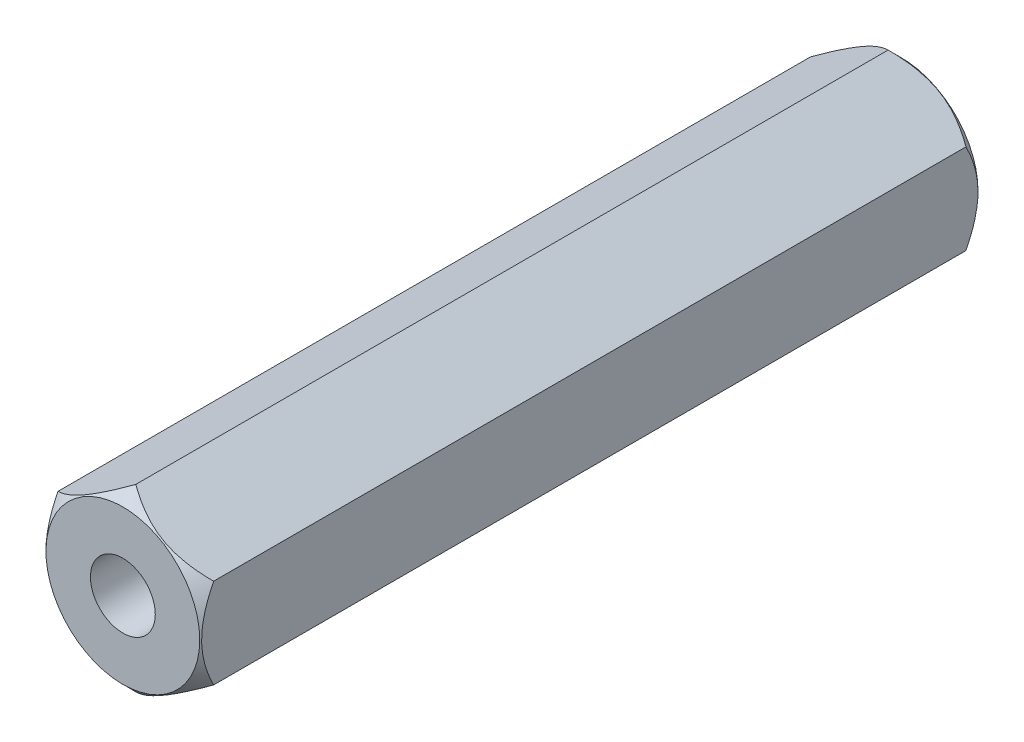
ISO-10303-21;
HEADER;
FILE_DESCRIPTION(('STEP AP214'),'2;1');
FILE_NAME('part.step','',(''),(''),'','','');
FILE_SCHEMA(('AUTOMOTIVE_DESIGN { 1 0 10303 214 1 1 1 1 }'));
ENDSEC;
DATA;
#1=APPLICATION_CONTEXT('core data for automotive mechanical design processes');
#2=APPLICATION_PROTOCOL_DEFINITION('international standard','automotive_design',2000,#1);
#3=PRODUCT_CONTEXT('',#1,'mechanical');
#4=PRODUCT('Part','Part','',(#3));
#5=PRODUCT_RELATED_PRODUCT_CATEGORY('part','',(#4));
#6=PRODUCT_DEFINITION_FORMATION('','',#4);
#7=PRODUCT_DEFINITION_CONTEXT('part definition',#1,'design');
#8=PRODUCT_DEFINITION('design','',#6,#7);
#9=PRODUCT_DEFINITION_SHAPE('','',#8);
#10=(LENGTH_UNIT() NAMED_UNIT(*) SI_UNIT(.MILLI.,.METRE.));
#11=(NAMED_UNIT(*) PLANE_ANGLE_UNIT() SI_UNIT($,.RADIAN.));
#12=(NAMED_UNIT(*) SI_UNIT($,.STERADIAN.) SOLID_ANGLE_UNIT());
#13=UNCERTAINTY_MEASURE_WITH_UNIT(LENGTH_MEASURE(1.E-05),#10,'distance_accuracy_value','');
#14=(GEOMETRIC_REPRESENTATION_CONTEXT(3) GLOBAL_UNCERTAINTY_ASSIGNED_CONTEXT((#13)) GLOBAL_UNIT_ASSIGNED_CONTEXT((#10,
#11,#12)) REPRESENTATION_CONTEXT('',''));
#15=CARTESIAN_POINT('',(0.,0.,0.));
#16=DIRECTION('',(0.,0.,1.));
#17=DIRECTION('',(1.,0.,0.));
#18=AXIS2_PLACEMENT_3D('',#15,#16,#17);
#19=CARTESIAN_POINT('',(2.99999999999998,1.73205080756891,15.));
#20=DIRECTION('',(-0.499999999999995,-0.866025403784441,0.));
#21=DIRECTION('',(0.866025403784442,-0.499999999999995,0.));
#22=AXIS2_PLACEMENT_3D('',#19,#20,#21);
#23=PLANE('',#22);
#24=CARTESIAN_POINT('',(3.00019999999998,1.73193533751508,14.4998845241729));
#25=CARTESIAN_POINT('',(2.89707648504423,1.79147372663456,14.5593716816782));
#26=CARTESIAN_POINT('',(2.79222861066933,1.85200767512887,14.6153650205345));
#27=CARTESIAN_POINT('',(2.57843232821888,1.97544301635337,14.7178874036211));
#28=CARTESIAN_POINT('',(2.46946358862022,2.03835614749391,14.7643594062587));
#29=CARTESIAN_POINT('',(2.24973336040295,2.16521745390425,14.8439668114837));
#30=CARTESIAN_POINT('',(2.13902782823776,2.2291333227006,14.8773022993573));
#31=CARTESIAN_POINT('',(1.91517958943465,2.3583721636312,14.9286624560207));
#32=CARTESIAN_POINT('',(1.80204372079298,2.42369118784647,14.9467254624644));
#33=CARTESIAN_POINT('',(1.60705904380727,2.53626564359202,14.9630230915495));
#34=CARTESIAN_POINT('',(1.52546204599784,2.58337569224236,14.9654356328262));
#35=CARTESIAN_POINT('',(1.36240077116988,2.67751916315868,14.9613705653429));
#36=CARTESIAN_POINT('',(1.28093655070098,2.72455255277573,14.9548898399717));
#37=CARTESIAN_POINT('',(1.11877988766159,2.81817374583241,14.9334082774848));
#38=CARTESIAN_POINT('',(1.03808841121566,2.86476099147977,14.9183979100327));
#39=CARTESIAN_POINT('',(0.87809130210862,2.95713536549228,14.880676353934));
#40=CARTESIAN_POINT('',(0.798785563690657,3.00292255491618,14.8579657556771));
#41=CARTESIAN_POINT('',(0.657993859197203,3.08420868340514,14.811239315146));
#42=CARTESIAN_POINT('',(0.596196277853935,3.11988753362894,14.7884516723192));
#43=CARTESIAN_POINT('',(0.473710582479749,3.1906046828251,14.7392037139425));
#44=CARTESIAN_POINT('',(0.41302250236437,3.22564296221632,14.7127432863338));
#45=CARTESIAN_POINT('',(0.292947002609118,3.29496858432309,14.6567430056086));
#46=CARTESIAN_POINT('',(0.233556167704067,3.32925789884292,14.6272128355216));
#47=CARTESIAN_POINT('',(0.115874438532723,3.39720147685869,14.5654609084245));
#48=CARTESIAN_POINT('',(0.0575828957522616,3.43085611477447,14.5332408033406));
#49=CARTESIAN_POINT('',(-0.000200000000000063,3.46421708519159,14.4998845241729));
#50=B_SPLINE_CURVE_WITH_KNOTS('',3,(#24,#25,#26,#27,#28,#29,#30,#31,#32,#33,#34,#35,#36,#37,#38,
#39,#40,#41,#42,#43,#44,#45,#46,#47,#48,#49),.UNSPECIFIED.,.F.,.F.,(4,2,2,2,2,2,2,2,2,2,2,2,4),
(0.,0.399603557139306,0.801535286397845,1.19708369162343,1.59163620080173,1.87398941755845,
2.15644160919094,2.43921001247427,2.7219567403214,2.94657516661927,3.17120044767273,
3.39513752837807,3.61893808380735),.UNSPECIFIED.);
#51=CARTESIAN_POINT('',(2.99999999999998,1.73205080756891,14.5));
#52=VERTEX_POINT('',#51);
#53=CARTESIAN_POINT('',(0.,3.46410161513776,14.5));
#54=VERTEX_POINT('',#53);
#55=EDGE_CURVE('E85',#52,#54,#50,.T.);
#56=ORIENTED_EDGE('',*,*,#55,.F.);
#57=DIRECTION('',(0.,0.,-1.));
#58=VECTOR('',#57,1.);
#59=CARTESIAN_POINT('',(2.99999999999998,1.73205080756891,15.));
#60=LINE('',#59,#58);
#61=CARTESIAN_POINT('',(2.99999999999998,1.73205080756891,-14.5));
#62=VERTEX_POINT('',#61);
#63=EDGE_CURVE('E55',#52,#62,#60,.T.);
#64=ORIENTED_EDGE('',*,*,#63,.T.);
#65=CARTESIAN_POINT('',(-0.0002,3.46421708519159,-14.4998845241729));
#66=CARTESIAN_POINT('',(0.102923514955747,3.40467869607211,-14.5593716816782));
#67=CARTESIAN_POINT('',(0.207771389330649,3.34414474757781,-14.6153650205345));
#68=CARTESIAN_POINT('',(0.421567671781093,3.2207094063533,-14.7178874036211));
#69=CARTESIAN_POINT('',(0.530536411379756,3.15779627521276,-14.7643594062587));
#70=CARTESIAN_POINT('',(0.750266639597023,3.03093496880243,-14.8439668114837));
#71=CARTESIAN_POINT('',(0.860972171762205,2.96701910000608,-14.8773022993573));
#72=CARTESIAN_POINT('',(1.08482041056532,2.83778025907548,-14.9286624560207));
#73=CARTESIAN_POINT('',(1.19795627920698,2.77246123486021,-14.9467254624644));
#74=CARTESIAN_POINT('',(1.39294095619269,2.65988677911466,-14.9630230915495));
#75=CARTESIAN_POINT('',(1.47453795400212,2.61277673046432,-14.9654356328262));
#76=CARTESIAN_POINT('',(1.63759922883008,2.518633259548,-14.9613705653429));
#77=CARTESIAN_POINT('',(1.71906344929898,2.47159986993096,-14.9548898399717));
#78=CARTESIAN_POINT('',(1.88122011233836,2.37797867687428,-14.9334082774848));
#79=CARTESIAN_POINT('',(1.96191158878429,2.33139143122691,-14.9183979100327));
#80=CARTESIAN_POINT('',(2.12190869789133,2.23901705721441,-14.880676353934));
#81=CARTESIAN_POINT('',(2.20121443630929,2.19322986779052,-14.8579657556772));
#82=CARTESIAN_POINT('',(2.34200614080274,2.11194373930155,-14.8112393151461));
#83=CARTESIAN_POINT('',(2.40380372214602,2.07626488907775,-14.7884516723192));
#84=CARTESIAN_POINT('',(2.52628941752021,2.00554773988158,-14.7392037139426));
#85=CARTESIAN_POINT('',(2.58697749763559,1.97050946049036,-14.7127432863338));
#86=CARTESIAN_POINT('',(2.70705299739085,1.90118383838359,-14.6567430056086));
#87=CARTESIAN_POINT('',(2.7664438322959,1.86689452386376,-14.6272128355216));
#88=CARTESIAN_POINT('',(2.88412556146725,1.79895094584798,-14.5654609084245));
#89=CARTESIAN_POINT('',(2.94241710424772,1.7652963079322,-14.5332408033406));
#90=CARTESIAN_POINT('',(3.00019999999998,1.73193533751508,-14.4998845241729));
#91=B_SPLINE_CURVE_WITH_KNOTS('',3,(#65,#66,#67,#68,#69,#70,#71,#72,#73,#74,#75,#76,#77,#78,#79,
#80,#81,#82,#83,#84,#85,#86,#87,#88,#89,#90),.UNSPECIFIED.,.F.,.F.,(4,2,2,2,2,2,2,2,2,2,2,2,4),
(0.,0.399603557139302,0.801535286397835,1.19708369162341,1.59163620080171,1.87398941755842,
2.15644160919091,2.43921001247423,2.72195674032136,2.94657516661924,3.17120044767272,
3.39513752837807,3.61893808380735),.UNSPECIFIED.);
#92=CARTESIAN_POINT('',(0.,3.46410161513776,-14.5));
#93=VERTEX_POINT('',#92);
#94=EDGE_CURVE('E100',#93,#62,#91,.T.);
#95=ORIENTED_EDGE('',*,*,#94,.F.);
#96=DIRECTION('',(0.,0.,-1.));
#97=VECTOR('',#96,1.);
#98=CARTESIAN_POINT('',(0.,3.46410161513776,15.));
#99=LINE('',#98,#97);
#100=EDGE_CURVE('E11',#54,#93,#99,.T.);
#101=ORIENTED_EDGE('',*,*,#100,.F.);
#102=EDGE_LOOP('',(#56,#64,#95,#101));
#103=FACE_BOUND('',#102,.T.);
#104=ADVANCED_FACE('F32',(#103),#23,.F.);
#105=CARTESIAN_POINT('',(0.,3.46410161513776,15.));
#106=DIRECTION('',(0.500000000000001,-0.866025403784438,0.));
#107=DIRECTION('',(0.866025403784438,0.500000000000001,0.));
#108=AXIS2_PLACEMENT_3D('',#105,#106,#107);
#109=PLANE('',#108);
#110=CARTESIAN_POINT('',(0.000200000000000247,3.46421708519159,14.4998845241729));
#111=CARTESIAN_POINT('',(-0.102923514955749,3.40467869607211,14.5593716816782));
#112=CARTESIAN_POINT('',(-0.207771389330652,3.3441447475778,14.6153650205345));
#113=CARTESIAN_POINT('',(-0.421567671781101,3.22070940635329,14.7178874036211));
#114=CARTESIAN_POINT('',(-0.530536411379767,3.15779627521275,14.7643594062587));
#115=CARTESIAN_POINT('',(-0.750266639597039,3.03093496880241,14.8439668114837));
#116=CARTESIAN_POINT('',(-0.860972171762223,2.96701910000606,14.8773022993573));
#117=CARTESIAN_POINT('',(-1.08482041056534,2.83778025907546,14.9286624560207));
#118=CARTESIAN_POINT('',(-1.19795627920701,2.77246123486019,14.9467254624644));
#119=CARTESIAN_POINT('',(-1.39294095619272,2.65988677911463,14.9630230915495));
#120=CARTESIAN_POINT('',(-1.47453795400215,2.61277673046429,14.9654356328262));
#121=CARTESIAN_POINT('',(-1.63759922883011,2.51863325954797,14.9613705653429));
#122=CARTESIAN_POINT('',(-1.71906344929901,2.47159986993092,14.9548898399717));
#123=CARTESIAN_POINT('',(-1.8812201123384,2.37797867687424,14.9334082774848));
#124=CARTESIAN_POINT('',(-1.96191158878433,2.33139143122688,14.9183979100327));
#125=CARTESIAN_POINT('',(-2.12190869789137,2.23901705721437,14.880676353934));
#126=CARTESIAN_POINT('',(-2.20121443630933,2.19322986779047,14.8579657556772));
#127=CARTESIAN_POINT('',(-2.34200614080278,2.11194373930151,14.811239315146));
#128=CARTESIAN_POINT('',(-2.40380372214605,2.0762648890777,14.7884516723192));
#129=CARTESIAN_POINT('',(-2.52628941752024,2.00554773988154,14.7392037139425));
#130=CARTESIAN_POINT('',(-2.58697749763562,1.97050946049032,14.7127432863338));
#131=CARTESIAN_POINT('',(-2.70705299739088,1.90118383838354,14.6567430056086));
#132=CARTESIAN_POINT('',(-2.76644383229593,1.86689452386372,14.6272128355216));
#133=CARTESIAN_POINT('',(-2.88412556146728,1.79895094584794,14.5654609084245));
#134=CARTESIAN_POINT('',(-2.94241710424774,1.76529630793216,14.5332408033406));
#135=CARTESIAN_POINT('',(-3.00020000000001,1.73193533751503,14.4998845241729));
#136=B_SPLINE_CURVE_WITH_KNOTS('',3,(#110,#111,#112,#113,#114,#115,#116,#117,#118,#119,#120,
#121,#122,#123,#124,#125,#126,#127,#128,#129,#130,#131,#132,#133,#134,#135),.UNSPECIFIED.,.F.,
.F.,(4,2,2,2,2,2,2,2,2,2,2,2,4),(0.,0.399603557139311,0.801535286397855,1.19708369162344,
1.59163620080175,1.87398941755847,2.15644160919096,2.43921001247428,2.72195674032142,
2.9465751666193,3.17120044767277,3.39513752837811,3.6189380838074),.UNSPECIFIED.);
#137=CARTESIAN_POINT('',(-3.00000000000001,1.73205080756887,14.5));
#138=VERTEX_POINT('',#137);
#139=EDGE_CURVE('E93',#54,#138,#136,.T.);
#140=ORIENTED_EDGE('',*,*,#139,.F.);
#141=ORIENTED_EDGE('',*,*,#100,.T.);
#142=CARTESIAN_POINT('',(-3.00020000000001,1.73193533751503,-14.4998845241729));
#143=CARTESIAN_POINT('',(-2.89707648504426,1.79147372663452,-14.5593716816782));
#144=CARTESIAN_POINT('',(-2.79222861066936,1.85200767512883,-14.6153650205345));
#145=CARTESIAN_POINT('',(-2.57843232821891,1.97544301635333,-14.7178874036211));
#146=CARTESIAN_POINT('',(-2.46946358862025,2.03835614749387,-14.7643594062587));
#147=CARTESIAN_POINT('',(-2.24973336040298,2.16521745390421,-14.8439668114837));
#148=CARTESIAN_POINT('',(-2.13902782823779,2.22913332270056,-14.8773022993573));
#149=CARTESIAN_POINT('',(-1.91517958943468,2.35837216363116,-14.9286624560207));
#150=CARTESIAN_POINT('',(-1.80204372079301,2.42369118784643,-14.9467254624644));
#151=CARTESIAN_POINT('',(-1.6070590438073,2.53626564359199,-14.9630230915495));
#152=CARTESIAN_POINT('',(-1.52546204599787,2.58337569224233,-14.9654356328262));
#153=CARTESIAN_POINT('',(-1.36240077116992,2.67751916315865,-14.9613705653429));
#154=CARTESIAN_POINT('',(-1.28093655070102,2.72455255277569,-14.9548898399717));
#155=CARTESIAN_POINT('',(-1.11877988766164,2.81817374583237,-14.9334082774848));
#156=CARTESIAN_POINT('',(-1.03808841121571,2.86476099147974,-14.9183979100327));
#157=CARTESIAN_POINT('',(-0.878091302108673,2.95713536549224,-14.880676353934));
#158=CARTESIAN_POINT('',(-0.798785563690712,3.00292255491614,-14.8579657556772));
#159=CARTESIAN_POINT('',(-0.657993859197255,3.0842086834051,-14.8112393151461));
#160=CARTESIAN_POINT('',(-0.596196277853981,3.11988753362891,-14.7884516723192));
#161=CARTESIAN_POINT('',(-0.473710582479786,3.19060468282508,-14.7392037139426));
#162=CARTESIAN_POINT('',(-0.413022502364402,3.2256429622163,-14.7127432863338));
#163=CARTESIAN_POINT('',(-0.292947002609141,3.29496858432307,-14.6567430056086));
#164=CARTESIAN_POINT('',(-0.233556167704085,3.32925789884291,-14.6272128355216));
#165=CARTESIAN_POINT('',(-0.115874438532732,3.39720147685869,-14.5654609084245));
#166=CARTESIAN_POINT('',(-0.0575828957522661,3.43085611477447,-14.5332408033406));
#167=CARTESIAN_POINT('',(0.000199999999999981,3.46421708519159,-14.4998845241729));
#168=B_SPLINE_CURVE_WITH_KNOTS('',3,(#142,#143,#144,#145,#146,#147,#148,#149,#150,#151,#152,
#153,#154,#155,#156,#157,#158,#159,#160,#161,#162,#163,#164,#165,#166,#167),.UNSPECIFIED.,.F.,
.F.,(4,2,2,2,2,2,2,2,2,2,2,2,4),(0.,0.399603557139307,0.801535286397846,1.19708369162343,
1.59163620080173,1.87398941755844,2.15644160919093,2.43921001247425,2.72195674032138,
2.94657516661927,3.17120044767275,3.39513752837811,3.6189380838074),.UNSPECIFIED.);
#169=CARTESIAN_POINT('',(-3.00000000000001,1.73205080756887,-14.5));
#170=VERTEX_POINT('',#169);
#171=EDGE_CURVE('E104',#170,#93,#168,.T.);
#172=ORIENTED_EDGE('',*,*,#171,.F.);
#173=DIRECTION('',(0.,0.,-1.));
#174=VECTOR('',#173,1.);
#175=CARTESIAN_POINT('',(-3.00000000000001,1.73205080756887,15.));
#176=LINE('',#175,#174);
#177=EDGE_CURVE('E40',#138,#170,#176,.T.);
#178=ORIENTED_EDGE('',*,*,#177,.F.);
#179=EDGE_LOOP('',(#140,#141,#172,#178));
#180=FACE_BOUND('',#179,.T.);
#181=ADVANCED_FACE('F134',(#180),#109,.F.);
#182=CARTESIAN_POINT('',(-3.00000000000001,1.73205080756887,15.));
#183=DIRECTION('',(1.,0.,0.));
#184=DIRECTION('',(0.,1.,0.));
#185=AXIS2_PLACEMENT_3D('',#182,#183,#184);
#186=PLANE('',#185);
#187=CARTESIAN_POINT('',(-2.99999999999999,-3.60017220967184,13.2778195131626));
#188=CARTESIAN_POINT('',(-2.99999999999999,-3.51313765104596,13.3446675914289));
#189=CARTESIAN_POINT('',(-2.99999999999999,-3.42563249287245,13.4109126193683));
#190=CARTESIAN_POINT('',(-2.99999999999999,-3.24948921836676,13.5419215469166));
#191=CARTESIAN_POINT('',(-2.99999999999999,-3.16085083752023,13.6066850905043));
#192=CARTESIAN_POINT('',(-2.99999999999999,-2.98160145725482,13.7349169449311));
#193=CARTESIAN_POINT('',(-2.99999999999999,-2.89098051262274,13.7983713994157));
#194=CARTESIAN_POINT('',(-2.99999999999999,-2.70822761313702,13.9230583092626));
#195=CARTESIAN_POINT('',(-2.99999999999999,-2.61609576318253,13.9842909179429));
#196=CARTESIAN_POINT('',(-2.99999999999999,-2.42422306954656,14.1077912376853));
#197=CARTESIAN_POINT('',(-2.99999999999999,-2.32436788808333,14.1698822034749));
#198=CARTESIAN_POINT('',(-2.99999999999999,-2.12231355534729,14.2901903464936));
#199=CARTESIAN_POINT('',(-2.99999999999999,-2.02011401548863,14.3484068751903));
#200=CARTESIAN_POINT('',(-2.99999999999999,-1.81334633897,14.4597248507824));
#201=CARTESIAN_POINT('',(-2.99999999999999,-1.70878635206411,14.512841317048));
#202=CARTESIAN_POINT('',(-2.99999999999999,-1.49671956345561,14.6127691597761));
#203=CARTESIAN_POINT('',(-2.99999999999999,-1.3892141758587,14.6595835002325));
#204=CARTESIAN_POINT('',(-3.,-1.18162451020427,14.7410539482376));
#205=CARTESIAN_POINT('',(-3.,-1.08183332025572,14.7764492520355));
#206=CARTESIAN_POINT('',(-3.,-0.879720922244446,14.839250905853));
#207=CARTESIAN_POINT('',(-3.,-0.777399552418952,14.8666567436397));
#208=CARTESIAN_POINT('',(-3.,-0.572612584452616,14.9115441590153));
#209=CARTESIAN_POINT('',(-3.,-0.470186961346727,14.9292050562223));
#210=CARTESIAN_POINT('',(-3.,-0.264078945488506,14.9542362750333));
#211=CARTESIAN_POINT('',(-3.,-0.160396813561161,14.9616086966165));
#212=CARTESIAN_POINT('',(-3.,0.0427096176213919,14.9654420851551));
#213=CARTESIAN_POINT('',(-3.,0.142125414358262,14.9623583505179));
#214=CARTESIAN_POINT('',(-3.,0.340174705596965,14.9464916416953));
#215=CARTESIAN_POINT('',(-3.,0.438808127729188,14.9337077805808));
#216=CARTESIAN_POINT('',(-3.,0.63624994970367,14.8989440803276));
#217=CARTESIAN_POINT('',(-3.,0.735029372915854,14.876802418897));
#218=CARTESIAN_POINT('',(-3.,0.930415217780143,14.8245472174801));
#219=CARTESIAN_POINT('',(-3.,1.02702176788805,14.7944341500981));
#220=CARTESIAN_POINT('',(-3.,1.2236758633484,14.7255236452003));
#221=CARTESIAN_POINT('',(-3.,1.32357580295862,14.6863096975049));
#222=CARTESIAN_POINT('',(-3.,1.52079115833372,14.6018315295272));
#223=CARTESIAN_POINT('',(-3.00000000000001,1.61810572975018,14.5565653610887));
#224=CARTESIAN_POINT('',(-3.00000000000001,1.81063206524839,14.4610486908598));
#225=CARTESIAN_POINT('',(-3.00000000000001,1.9058359585856,14.410782453134));
#226=CARTESIAN_POINT('',(-3.00000000000001,2.09405942839048,14.3063762546385));
#227=CARTESIAN_POINT('',(-3.00000000000001,2.1870793859314,14.2522369764459));
#228=CARTESIAN_POINT('',(-3.00000000000001,2.36667514656201,14.1435916608642));
#229=CARTESIAN_POINT('',(-3.00000000000001,2.453342301347,14.089235834379));
#230=CARTESIAN_POINT('',(-3.00000000000001,2.6251876735461,13.9782125526764));
#231=CARTESIAN_POINT('',(-3.00000000000001,2.71036577854073,13.9215449239914));
#232=CARTESIAN_POINT('',(-3.00000000000001,2.87874255832936,13.8067722175246));
#233=CARTESIAN_POINT('',(-3.00000000000001,2.96195163950933,13.7486823515131));
#234=CARTESIAN_POINT('',(-3.00000000000001,3.12722859541802,13.6309469679733));
#235=CARTESIAN_POINT('',(-3.00000000000001,3.20929677837715,13.5713018836442));
#236=CARTESIAN_POINT('',(-3.00000000000001,3.29088643476904,13.5110202632482));
#237=B_SPLINE_CURVE_WITH_KNOTS('',3,(#187,#188,#189,#190,#191,#192,#193,#194,#195,#196,#197,
#198,#199,#200,#201,#202,#203,#204,#205,#206,#207,#208,#209,#210,#211,#212,#213,#214,#215,#216,
#217,#218,#219,#220,#221,#222,#223,#224,#225,#226,#227,#228,#229,#230,#231,#232,#233,#234,#235,
#236),.UNSPECIFIED.,.F.,.F.,(4,2,2,2,2,2,2,2,2,2,2,2,2,2,2,2,2,2,2,2,2,2,2,2,4),(0.,
0.329237185389701,0.658552677025003,0.990410104597518,1.32224458870014,1.67493114147262,
2.02767658187214,2.37934911783584,2.73085567419849,3.04822903781338,3.36562274488828,
3.6769626630627,3.9882390243943,4.28613845351066,4.58406512428139,4.88736936813562,
5.190655633883,5.51237069563638,5.83418956505938,6.15705537344392,6.47986442011631,
6.78672818696386,7.09361502205704,7.39803558554752,7.70237224125957),.UNSPECIFIED.);
#238=CARTESIAN_POINT('',(-2.99999999999999,-1.73205080756889,14.5));
#239=VERTEX_POINT('',#238);
#240=EDGE_CURVE('E123',#138,#239,#237,.F.);
#241=ORIENTED_EDGE('',*,*,#240,.F.);
#242=ORIENTED_EDGE('',*,*,#177,.T.);
#243=CARTESIAN_POINT('',(-2.99999999999999,-3.60017220967182,-13.2778195131625));
#244=CARTESIAN_POINT('',(-2.99999999999999,-3.51313765104594,-13.3446675914289));
#245=CARTESIAN_POINT('',(-2.99999999999999,-3.42563249287243,-13.4109126193683));
#246=CARTESIAN_POINT('',(-2.99999999999999,-3.24948921836674,-13.5419215469166));
#247=CARTESIAN_POINT('',(-2.99999999999999,-3.16085083752022,-13.6066850905043));
#248=CARTESIAN_POINT('',(-2.99999999999999,-2.98160145725481,-13.7349169449311));
#249=CARTESIAN_POINT('',(-2.99999999999999,-2.89098051262273,-13.7983713994157));
#250=CARTESIAN_POINT('',(-2.99999999999999,-2.70822761313701,-13.9230583092626));
#251=CARTESIAN_POINT('',(-2.99999999999999,-2.61609576318252,-13.9842909179429));
#252=CARTESIAN_POINT('',(-2.99999999999999,-2.42422306954656,-14.1077912376853));
#253=CARTESIAN_POINT('',(-2.99999999999999,-2.32436788808332,-14.1698822034749));
#254=CARTESIAN_POINT('',(-2.99999999999999,-2.12231355534729,-14.2901903464936));
#255=CARTESIAN_POINT('',(-2.99999999999999,-2.02011401548863,-14.3484068751903));
#256=CARTESIAN_POINT('',(-2.99999999999999,-1.81334633897,-14.4597248507824));
#257=CARTESIAN_POINT('',(-2.99999999999999,-1.70878635206411,-14.512841317048));
#258=CARTESIAN_POINT('',(-2.99999999999999,-1.49671956345561,-14.6127691597761));
#259=CARTESIAN_POINT('',(-2.99999999999999,-1.3892141758587,-14.6595835002325));
#260=CARTESIAN_POINT('',(-3.,-1.18162451020427,-14.7410539482376));
#261=CARTESIAN_POINT('',(-3.,-1.08183332025572,-14.7764492520355));
#262=CARTESIAN_POINT('',(-3.,-0.879720922244454,-14.839250905853));
#263=CARTESIAN_POINT('',(-3.,-0.777399552418961,-14.8666567436397));
#264=CARTESIAN_POINT('',(-3.,-0.572612584452628,-14.9115441590153));
#265=CARTESIAN_POINT('',(-3.,-0.470186961346741,-14.9292050562223));
#266=CARTESIAN_POINT('',(-3.,-0.264078945488523,-14.9542362750334));
#267=CARTESIAN_POINT('',(-3.,-0.160396813561179,-14.9616086966165));
#268=CARTESIAN_POINT('',(-3.,0.0427096176213708,-14.9654420851551));
#269=CARTESIAN_POINT('',(-3.,0.14212541435824,-14.9623583505179));
#270=CARTESIAN_POINT('',(-3.,0.34017470559694,-14.9464916416953));
#271=CARTESIAN_POINT('',(-3.,0.438808127729162,-14.9337077805808));
#272=CARTESIAN_POINT('',(-3.,0.636249949703642,-14.8989440803276));
#273=CARTESIAN_POINT('',(-3.,0.735029372915826,-14.876802418897));
#274=CARTESIAN_POINT('',(-3.,0.930415217780112,-14.8245472174801));
#275=CARTESIAN_POINT('',(-3.,1.02702176788802,-14.7944341500982));
#276=CARTESIAN_POINT('',(-3.,1.22367586334836,-14.7255236452003));
#277=CARTESIAN_POINT('',(-3.,1.32357580295858,-14.6863096975049));
#278=CARTESIAN_POINT('',(-3.,1.52079115833368,-14.6018315295273));
#279=CARTESIAN_POINT('',(-3.00000000000001,1.61810572975013,-14.5565653610888));
#280=CARTESIAN_POINT('',(-3.00000000000001,1.81063206524833,-14.4610486908599));
#281=CARTESIAN_POINT('',(-3.00000000000001,1.90583595858554,-14.410782453134));
#282=CARTESIAN_POINT('',(-3.00000000000001,2.09405942839041,-14.3063762546385));
#283=CARTESIAN_POINT('',(-3.00000000000001,2.18707938593132,-14.252236976446));
#284=CARTESIAN_POINT('',(-3.00000000000001,2.36667514656192,-14.1435916608643));
#285=CARTESIAN_POINT('',(-3.00000000000001,2.45334230134691,-14.089235834379));
#286=CARTESIAN_POINT('',(-3.00000000000001,2.625187673546,-13.9782125526765));
#287=CARTESIAN_POINT('',(-3.00000000000001,2.71036577854063,-13.9215449239914));
#288=CARTESIAN_POINT('',(-3.00000000000001,2.87874255832925,-13.8067722175247));
#289=CARTESIAN_POINT('',(-3.00000000000001,2.96195163950922,-13.7486823515132));
#290=CARTESIAN_POINT('',(-3.00000000000001,3.1272285954179,-13.6309469679734));
#291=CARTESIAN_POINT('',(-3.00000000000001,3.20929677837702,-13.5713018836443));
#292=CARTESIAN_POINT('',(-3.00000000000001,3.29088643476891,-13.5110202632483));
#293=B_SPLINE_CURVE_WITH_KNOTS('',3,(#243,#244,#245,#246,#247,#248,#249,#250,#251,#252,#253,
#254,#255,#256,#257,#258,#259,#260,#261,#262,#263,#264,#265,#266,#267,#268,#269,#270,#271,#272,
#273,#274,#275,#276,#277,#278,#279,#280,#281,#282,#283,#284,#285,#286,#287,#288,#289,#290,#291,
#292),.UNSPECIFIED.,.F.,.F.,(4,2,2,2,2,2,2,2,2,2,2,2,2,2,2,2,2,2,2,2,2,2,2,2,4),(0.,
0.329237185389698,0.658552677025,0.990410104597515,1.32224458870014,1.67493114147261,
2.02767658187213,2.37934911783583,2.73085567419847,3.04822903781336,3.36562274488826,
3.67696266306267,3.98823902439427,4.28613845351063,4.58406512428135,4.88736936813558,
5.19065563388295,5.51237069563632,5.83418956505931,6.15705537344383,6.47986442011621,
6.78672818696375,7.09361502205691,7.39803558554738,7.70237224125941),.UNSPECIFIED.);
#294=CARTESIAN_POINT('',(-2.99999999999999,-1.73205080756889,-14.5));
#295=VERTEX_POINT('',#294);
#296=EDGE_CURVE('E122',#295,#170,#293,.T.);
#297=ORIENTED_EDGE('',*,*,#296,.F.);
#298=DIRECTION('',(0.,0.,-1.));
#299=VECTOR('',#298,1.);
#300=CARTESIAN_POINT('',(-2.99999999999999,-1.73205080756889,15.));
#301=LINE('',#300,#299);
#302=EDGE_CURVE('E114',#239,#295,#301,.T.);
#303=ORIENTED_EDGE('',*,*,#302,.F.);
#304=EDGE_LOOP('',(#241,#242,#297,#303));
#305=FACE_BOUND('',#304,.T.);
#306=ADVANCED_FACE('F120',(#305),#186,.F.);
#307=CARTESIAN_POINT('',(-2.99999999999999,-1.73205080756889,15.));
#308=DIRECTION('',(0.499999999999995,0.866025403784442,0.));
#309=DIRECTION('',(-0.866025403784442,0.499999999999995,0.));
#310=AXIS2_PLACEMENT_3D('',#307,#308,#309);
#311=PLANE('',#310);
#312=CARTESIAN_POINT('',(-3.00019999999999,-1.73193533751505,14.4998845241729));
#313=CARTESIAN_POINT('',(-2.89707648504424,-1.79147372663454,14.5593716816782));
#314=CARTESIAN_POINT('',(-2.79222861066934,-1.85200767512885,14.6153650205345));
#315=CARTESIAN_POINT('',(-2.57843232821889,-1.97544301635335,14.7178874036211));
#316=CARTESIAN_POINT('',(-2.46946358862022,-2.0383561474939,14.7643594062587));
#317=CARTESIAN_POINT('',(-2.24973336040295,-2.16521745390423,14.8439668114837));
#318=CARTESIAN_POINT('',(-2.13902782823777,-2.22913332270058,14.8773022993573));
#319=CARTESIAN_POINT('',(-1.91517958943465,-2.35837216363119,14.9286624560207));
#320=CARTESIAN_POINT('',(-1.80204372079298,-2.42369118784645,14.9467254624644));
#321=CARTESIAN_POINT('',(-1.60705904380727,-2.53626564359201,14.9630230915495));
#322=CARTESIAN_POINT('',(-1.52546204599783,-2.58337569224235,14.9654356328262));
#323=CARTESIAN_POINT('',(-1.36240077116988,-2.67751916315867,14.9613705653429));
#324=CARTESIAN_POINT('',(-1.28093655070097,-2.72455255277571,14.9548898399717));
#325=CARTESIAN_POINT('',(-1.11877988766159,-2.81817374583239,14.9334082774848));
#326=CARTESIAN_POINT('',(-1.03808841121566,-2.86476099147976,14.9183979100327));
#327=CARTESIAN_POINT('',(-0.878091302108619,-2.95713536549227,14.880676353934));
#328=CARTESIAN_POINT('',(-0.798785563690657,-3.00292255491616,14.8579657556772));
#329=CARTESIAN_POINT('',(-0.6579938591972,-3.08420868340512,14.811239315146));
#330=CARTESIAN_POINT('',(-0.59619627785393,-3.11988753362893,14.7884516723192));
#331=CARTESIAN_POINT('',(-0.47371058247974,-3.19060468282509,14.7392037139425));
#332=CARTESIAN_POINT('',(-0.413022502364359,-3.22564296221631,14.7127432863338));
#333=CARTESIAN_POINT('',(-0.292947002609104,-3.29496858432309,14.6567430056086));
#334=CARTESIAN_POINT('',(-0.233556167704051,-3.32925789884291,14.6272128355216));
#335=CARTESIAN_POINT('',(-0.115874438532704,-3.39720147685869,14.5654609084245));
#336=CARTESIAN_POINT('',(-0.0575828957522401,-3.43085611477447,14.5332408033406));
#337=CARTESIAN_POINT('',(0.000200000000024296,-3.46421708519159,14.4998845241729));
#338=B_SPLINE_CURVE_WITH_KNOTS('',3,(#312,#313,#314,#315,#316,#317,#318,#319,#320,#321,#322,
#323,#324,#325,#326,#327,#328,#329,#330,#331,#332,#333,#334,#335,#336,#337),.UNSPECIFIED.,.F.,
.F.,(4,2,2,2,2,2,2,2,2,2,2,2,4),(0.,0.39960355713931,0.801535286397854,1.19708369162344,
1.59163620080175,1.87398941755847,2.15644160919096,2.43921001247428,2.72195674032142,
2.9465751666193,3.17120044767276,3.39513752837811,3.61893808380739),.UNSPECIFIED.);
#339=CARTESIAN_POINT('',(0.,-3.46410161513776,14.5));
#340=VERTEX_POINT('',#339);
#341=EDGE_CURVE('E189',#239,#340,#338,.T.);
#342=ORIENTED_EDGE('',*,*,#341,.F.);
#343=ORIENTED_EDGE('',*,*,#302,.T.);
#344=CARTESIAN_POINT('',(0.00020000000002419,-3.4642170851916,-14.4998845241729));
#345=CARTESIAN_POINT('',(-0.102923514955724,-3.40467869607211,-14.5593716816782));
#346=CARTESIAN_POINT('',(-0.207771389330627,-3.3441447475778,-14.6153650205345));
#347=CARTESIAN_POINT('',(-0.421567671781074,-3.2207094063533,-14.7178874036211));
#348=CARTESIAN_POINT('',(-0.530536411379738,-3.15779627521276,-14.7643594062587));
#349=CARTESIAN_POINT('',(-0.750266639597008,-3.03093496880242,-14.8439668114837));
#350=CARTESIAN_POINT('',(-0.860972171762192,-2.96701910000607,-14.8773022993573));
#351=CARTESIAN_POINT('',(-1.08482041056531,-2.83778025907547,-14.9286624560207));
#352=CARTESIAN_POINT('',(-1.19795627920697,-2.7724612348602,-14.9467254624644));
#353=CARTESIAN_POINT('',(-1.39294095619268,-2.65988677911465,-14.9630230915495));
#354=CARTESIAN_POINT('',(-1.47453795400212,-2.61277673046431,-14.9654356328262));
#355=CARTESIAN_POINT('',(-1.63759922883007,-2.51863325954799,-14.9613705653429));
#356=CARTESIAN_POINT('',(-1.71906344929897,-2.47159986993095,-14.9548898399717));
#357=CARTESIAN_POINT('',(-1.88122011233835,-2.37797867687427,-14.9334082774848));
#358=CARTESIAN_POINT('',(-1.96191158878428,-2.33139143122691,-14.9183979100327));
#359=CARTESIAN_POINT('',(-2.12190869789132,-2.2390170572144,-14.880676353934));
#360=CARTESIAN_POINT('',(-2.20121443630928,-2.19322986779051,-14.8579657556772));
#361=CARTESIAN_POINT('',(-2.34200614080274,-2.11194373930154,-14.8112393151461));
#362=CARTESIAN_POINT('',(-2.40380372214601,-2.07626488907774,-14.7884516723192));
#363=CARTESIAN_POINT('',(-2.52628941752021,-2.00554773988157,-14.7392037139426));
#364=CARTESIAN_POINT('',(-2.58697749763559,-1.97050946049035,-14.7127432863338));
#365=CARTESIAN_POINT('',(-2.70705299739085,-1.90118383838357,-14.6567430056086));
#366=CARTESIAN_POINT('',(-2.76644383229591,-1.86689452386374,-14.6272128355216));
#367=CARTESIAN_POINT('',(-2.88412556146726,-1.79895094584796,-14.5654609084245));
#368=CARTESIAN_POINT('',(-2.94241710424773,-1.76529630793218,-14.5332408033406));
#369=CARTESIAN_POINT('',(-3.00019999999999,-1.73193533751505,-14.4998845241729));
#370=B_SPLINE_CURVE_WITH_KNOTS('',3,(#344,#345,#346,#347,#348,#349,#350,#351,#352,#353,#354,
#355,#356,#357,#358,#359,#360,#361,#362,#363,#364,#365,#366,#367,#368,#369),.UNSPECIFIED.,.F.,
.F.,(4,2,2,2,2,2,2,2,2,2,2,2,4),(0.,0.399603557139308,0.801535286397847,1.19708369162343,
1.59163620080173,1.87398941755844,2.15644160919093,2.43921001247425,2.72195674032138,
2.94657516661927,3.17120044767275,3.39513752837811,3.6189380838074),.UNSPECIFIED.);
#371=CARTESIAN_POINT('',(0.,-3.46410161513776,-14.5));
#372=VERTEX_POINT('',#371);
#373=EDGE_CURVE('E132',#372,#295,#370,.T.);
#374=ORIENTED_EDGE('',*,*,#373,.F.);
#375=DIRECTION('',(0.,0.,-1.));
#376=VECTOR('',#375,1.);
#377=CARTESIAN_POINT('',(0.,-3.46410161513776,15.));
#378=LINE('',#377,#376);
#379=EDGE_CURVE('E102',#340,#372,#378,.T.);
#380=ORIENTED_EDGE('',*,*,#379,.F.);
#381=EDGE_LOOP('',(#342,#343,#374,#380));
#382=FACE_BOUND('',#381,.T.);
#383=ADVANCED_FACE('F180',(#382),#311,.F.);
#384=CARTESIAN_POINT('',(0.,-3.46410161513776,15.));
#385=DIRECTION('',(-0.500000000000007,0.866025403784435,0.));
#386=DIRECTION('',(-0.866025403784435,-0.500000000000007,0.));
#387=AXIS2_PLACEMENT_3D('',#384,#385,#386);
#388=PLANE('',#387);
#389=CARTESIAN_POINT('',(-0.000199999999976056,-3.46421708519159,14.4998845241729));
#390=CARTESIAN_POINT('',(0.102923514955773,-3.40467869607211,14.5593716816782));
#391=CARTESIAN_POINT('',(0.207771389330676,-3.3441447475778,14.6153650205345));
#392=CARTESIAN_POINT('',(0.421567671781124,-3.22070940635329,14.7178874036211));
#393=CARTESIAN_POINT('',(0.530536411379789,-3.15779627521275,14.7643594062587));
#394=CARTESIAN_POINT('',(0.75026663959706,-3.0309349688024,14.8439668114837));
#395=CARTESIAN_POINT('',(0.860972171762244,-2.96701910000605,14.8773022993573));
#396=CARTESIAN_POINT('',(1.08482041056536,-2.83778025907545,14.9286624560207));
#397=CARTESIAN_POINT('',(1.19795627920703,-2.77246123486018,14.9467254624644));
#398=CARTESIAN_POINT('',(1.39294095619274,-2.65988677911462,14.9630230915495));
#399=CARTESIAN_POINT('',(1.47453795400217,-2.61277673046428,14.9654356328262));
#400=CARTESIAN_POINT('',(1.63759922883013,-2.51863325954795,14.9613705653429));
#401=CARTESIAN_POINT('',(1.71906344929903,-2.47159986993091,14.9548898399717));
#402=CARTESIAN_POINT('',(1.88122011233841,-2.37797867687423,14.9334082774848));
#403=CARTESIAN_POINT('',(1.96191158878435,-2.33139143122686,14.9183979100327));
#404=CARTESIAN_POINT('',(2.12190869789138,-2.23901705721435,14.880676353934));
#405=CARTESIAN_POINT('',(2.20121443630934,-2.19322986779046,14.8579657556772));
#406=CARTESIAN_POINT('',(2.3420061408028,-2.11194373930149,14.811239315146));
#407=CARTESIAN_POINT('',(2.40380372214607,-2.07626488907769,14.7884516723192));
#408=CARTESIAN_POINT('',(2.52628941752026,-2.00554773988152,14.7392037139425));
#409=CARTESIAN_POINT('',(2.58697749763564,-1.9705094604903,14.7127432863338));
#410=CARTESIAN_POINT('',(2.70705299739089,-1.90118383838353,14.6567430056086));
#411=CARTESIAN_POINT('',(2.76644383229595,-1.8668945238637,14.6272128355216));
#412=CARTESIAN_POINT('',(2.88412556146729,-1.79895094584792,14.5654609084245));
#413=CARTESIAN_POINT('',(2.94241710424775,-1.76529630793214,14.5332408033406));
#414=CARTESIAN_POINT('',(3.00020000000002,-1.73193533751501,14.4998845241729));
#415=B_SPLINE_CURVE_WITH_KNOTS('',3,(#389,#390,#391,#392,#393,#394,#395,#396,#397,#398,#399,
#400,#401,#402,#403,#404,#405,#406,#407,#408,#409,#410,#411,#412,#413,#414),.UNSPECIFIED.,.F.,
.F.,(4,2,2,2,2,2,2,2,2,2,2,2,4),(0.,0.399603557139311,0.801535286397856,1.19708369162344,
1.59163620080175,1.87398941755847,2.15644160919096,2.43921001247428,2.72195674032142,
2.9465751666193,3.17120044767277,3.39513752837811,3.61893808380739),.UNSPECIFIED.);
#416=CARTESIAN_POINT('',(3.00000000000002,-1.73205080756885,14.5));
#417=VERTEX_POINT('',#416);
#418=EDGE_CURVE('E47',#340,#417,#415,.T.);
#419=ORIENTED_EDGE('',*,*,#418,.F.);
#420=ORIENTED_EDGE('',*,*,#379,.T.);
#421=CARTESIAN_POINT('',(3.00020000000002,-1.73193533751501,-14.4998845241729));
#422=CARTESIAN_POINT('',(2.89707648504427,-1.7914737266345,-14.5593716816782));
#423=CARTESIAN_POINT('',(2.79222861066937,-1.85200767512881,-14.6153650205345));
#424=CARTESIAN_POINT('',(2.57843232821892,-1.97544301635331,-14.7178874036211));
#425=CARTESIAN_POINT('',(2.46946358862026,-2.03835614749386,-14.7643594062587));
#426=CARTESIAN_POINT('',(2.24973336040299,-2.1652174539042,-14.8439668114837));
#427=CARTESIAN_POINT('',(2.13902782823781,-2.22913332270055,-14.8773022993573));
#428=CARTESIAN_POINT('',(1.91517958943469,-2.35837216363115,-14.9286624560207));
#429=CARTESIAN_POINT('',(1.80204372079303,-2.42369118784642,-14.9467254624644));
#430=CARTESIAN_POINT('',(1.60705904380732,-2.53626564359198,-14.9630230915495));
#431=CARTESIAN_POINT('',(1.52546204599789,-2.58337569224232,-14.9654356328262));
#432=CARTESIAN_POINT('',(1.36240077116993,-2.67751916315864,-14.9613705653429));
#433=CARTESIAN_POINT('',(1.28093655070104,-2.72455255277568,-14.9548898399717));
#434=CARTESIAN_POINT('',(1.11877988766166,-2.81817374583236,-14.9334082774848));
#435=CARTESIAN_POINT('',(1.03808841121572,-2.86476099147973,-14.9183979100327));
#436=CARTESIAN_POINT('',(0.878091302108692,-2.95713536549224,-14.880676353934));
#437=CARTESIAN_POINT('',(0.798785563690732,-3.00292255491613,-14.8579657556772));
#438=CARTESIAN_POINT('',(0.657993859197275,-3.0842086834051,-14.8112393151461));
#439=CARTESIAN_POINT('',(0.596196277854002,-3.1198875336289,-14.7884516723192));
#440=CARTESIAN_POINT('',(0.473710582479807,-3.19060468282507,-14.7392037139426));
#441=CARTESIAN_POINT('',(0.413022502364423,-3.22564296221629,-14.7127432863338));
#442=CARTESIAN_POINT('',(0.292947002609162,-3.29496858432307,-14.6567430056086));
#443=CARTESIAN_POINT('',(0.233556167704107,-3.3292578988429,-14.6272128355216));
#444=CARTESIAN_POINT('',(0.115874438532755,-3.39720147685869,-14.5654609084245));
#445=CARTESIAN_POINT('',(0.0575828957522897,-3.43085611477447,-14.5332408033406));
#446=CARTESIAN_POINT('',(-0.000199999999976104,-3.46421708519159,-14.4998845241729));
#447=B_SPLINE_CURVE_WITH_KNOTS('',3,(#421,#422,#423,#424,#425,#426,#427,#428,#429,#430,#431,
#432,#433,#434,#435,#436,#437,#438,#439,#440,#441,#442,#443,#444,#445,#446),.UNSPECIFIED.,.F.,
.F.,(4,2,2,2,2,2,2,2,2,2,2,2,4),(0.,0.399603557139308,0.801535286397848,1.19708369162343,
1.59163620080173,1.87398941755845,2.15644160919093,2.43921001247425,2.72195674032138,
2.94657516661927,3.17120044767275,3.39513752837811,3.6189380838074),.UNSPECIFIED.);
#448=CARTESIAN_POINT('',(3.00000000000002,-1.73205080756885,-14.5));
#449=VERTEX_POINT('',#448);
#450=EDGE_CURVE('E168',#449,#372,#447,.T.);
#451=ORIENTED_EDGE('',*,*,#450,.F.);
#452=DIRECTION('',(0.,0.,-1.));
#453=VECTOR('',#452,1.);
#454=CARTESIAN_POINT('',(3.00000000000002,-1.73205080756885,15.));
#455=LINE('',#454,#453);
#456=EDGE_CURVE('E99',#417,#449,#455,.T.);
#457=ORIENTED_EDGE('',*,*,#456,.F.);
#458=EDGE_LOOP('',(#419,#420,#451,#457));
#459=FACE_BOUND('',#458,.T.);
#460=ADVANCED_FACE('F183',(#459),#388,.F.);
#461=CARTESIAN_POINT('',(3.00000000000002,-1.73205080756885,15.));
#462=DIRECTION('',(-1.,0.,0.));
#463=DIRECTION('',(0.,-1.,0.));
#464=AXIS2_PLACEMENT_3D('',#461,#462,#463);
#465=PLANE('',#464);
#466=CARTESIAN_POINT('',(3.00000000000004,-3.6001722096718,13.2778195131626));
#467=CARTESIAN_POINT('',(3.00000000000004,-3.51313765104592,13.3446675914289));
#468=CARTESIAN_POINT('',(3.00000000000004,-3.42563249287241,13.4109126193683));
#469=CARTESIAN_POINT('',(3.00000000000003,-3.24948921836672,13.5419215469166));
#470=CARTESIAN_POINT('',(3.00000000000003,-3.16085083752019,13.6066850905043));
#471=CARTESIAN_POINT('',(3.00000000000003,-2.98160145725478,13.7349169449311));
#472=CARTESIAN_POINT('',(3.00000000000003,-2.8909805126227,13.7983713994157));
#473=CARTESIAN_POINT('',(3.00000000000003,-2.70822761313698,13.9230583092626));
#474=CARTESIAN_POINT('',(3.00000000000003,-2.61609576318249,13.9842909179429));
#475=CARTESIAN_POINT('',(3.00000000000003,-2.42422306954652,14.1077912376853));
#476=CARTESIAN_POINT('',(3.00000000000002,-2.32436788808329,14.1698822034749));
#477=CARTESIAN_POINT('',(3.00000000000002,-2.12231355534725,14.2901903464936));
#478=CARTESIAN_POINT('',(3.00000000000002,-2.02011401548859,14.3484068751903));
#479=CARTESIAN_POINT('',(3.00000000000002,-1.81334633896996,14.4597248507824));
#480=CARTESIAN_POINT('',(3.00000000000002,-1.70878635206407,14.512841317048));
#481=CARTESIAN_POINT('',(3.00000000000002,-1.49671956345557,14.6127691597761));
#482=CARTESIAN_POINT('',(3.00000000000001,-1.38921417585866,14.6595835002325));
#483=CARTESIAN_POINT('',(3.00000000000001,-1.18162451020423,14.7410539482376));
#484=CARTESIAN_POINT('',(3.00000000000001,-1.08183332025568,14.7764492520355));
#485=CARTESIAN_POINT('',(3.00000000000001,-0.879720922244405,14.839250905853));
#486=CARTESIAN_POINT('',(3.00000000000001,-0.777399552418911,14.8666567436397));
#487=CARTESIAN_POINT('',(3.00000000000001,-0.572612584452575,14.9115441590153));
#488=CARTESIAN_POINT('',(3.,-0.470186961346686,14.9292050562223));
#489=CARTESIAN_POINT('',(3.,-0.264078945488465,14.9542362750333));
#490=CARTESIAN_POINT('',(3.,-0.16039681356112,14.9616086966165));
#491=CARTESIAN_POINT('',(3.,0.0427096176214335,14.9654420851551));
#492=CARTESIAN_POINT('',(3.,0.142125414358304,14.9623583505179));
#493=CARTESIAN_POINT('',(3.,0.340174705597006,14.9464916416953));
#494=CARTESIAN_POINT('',(3.,0.438808127729229,14.9337077805808));
#495=CARTESIAN_POINT('',(2.99999999999999,0.636249949703711,14.8989440803276));
#496=CARTESIAN_POINT('',(2.99999999999999,0.735029372915895,14.876802418897));
#497=CARTESIAN_POINT('',(2.99999999999999,0.930415217780184,14.8245472174801));
#498=CARTESIAN_POINT('',(2.99999999999999,1.02702176788809,14.7944341500981));
#499=CARTESIAN_POINT('',(2.99999999999999,1.22367586334844,14.7255236452003));
#500=CARTESIAN_POINT('',(2.99999999999999,1.32357580295867,14.6863096975049));
#501=CARTESIAN_POINT('',(2.99999999999998,1.52079115833377,14.6018315295272));
#502=CARTESIAN_POINT('',(2.99999999999998,1.61810572975022,14.5565653610887));
#503=CARTESIAN_POINT('',(2.99999999999998,1.81063206524844,14.4610486908598));
#504=CARTESIAN_POINT('',(2.99999999999998,1.90583595858565,14.410782453134));
#505=CARTESIAN_POINT('',(2.99999999999998,2.09405942839053,14.3063762546385));
#506=CARTESIAN_POINT('',(2.99999999999998,2.18707938593144,14.2522369764459));
#507=CARTESIAN_POINT('',(2.99999999999998,2.36667514656205,14.1435916608642));
#508=CARTESIAN_POINT('',(2.99999999999997,2.45334230134704,14.089235834379));
#509=CARTESIAN_POINT('',(2.99999999999997,2.62518767354614,13.9782125526764));
#510=CARTESIAN_POINT('',(2.99999999999997,2.71036577854078,13.9215449239914));
#511=CARTESIAN_POINT('',(2.99999999999997,2.8787425583294,13.8067722175246));
#512=CARTESIAN_POINT('',(2.99999999999997,2.96195163950937,13.7486823515131));
#513=CARTESIAN_POINT('',(2.99999999999997,3.12722859541806,13.6309469679733));
#514=CARTESIAN_POINT('',(2.99999999999997,3.20929677837719,13.5713018836442));
#515=CARTESIAN_POINT('',(2.99999999999997,3.29088643476908,13.5110202632482));
#516=B_SPLINE_CURVE_WITH_KNOTS('',3,(#466,#467,#468,#469,#470,#471,#472,#473,#474,#475,#476,
#477,#478,#479,#480,#481,#482,#483,#484,#485,#486,#487,#488,#489,#490,#491,#492,#493,#494,#495,
#496,#497,#498,#499,#500,#501,#502,#503,#504,#505,#506,#507,#508,#509,#510,#511,#512,#513,#514,
#515),.UNSPECIFIED.,.F.,.F.,(4,2,2,2,2,2,2,2,2,2,2,2,2,2,2,2,2,2,2,2,2,2,2,2,4),(0.,
0.329237185389701,0.658552677025004,0.990410104597522,1.32224458870015,1.67493114147262,
2.02767658187214,2.37934911783584,2.73085567419849,3.04822903781338,3.36562274488828,
3.6769626630627,3.98823902439431,4.28613845351067,4.58406512428139,4.88736936813563,
5.190655633883,5.51237069563638,5.83418956505938,6.15705537344392,6.47986442011631,
6.78672818696387,7.09361502205704,7.39803558554752,7.70237224125957),.UNSPECIFIED.);
#517=EDGE_CURVE('E83',#417,#52,#516,.T.);
#518=ORIENTED_EDGE('',*,*,#517,.F.);
#519=ORIENTED_EDGE('',*,*,#456,.T.);
#520=CARTESIAN_POINT('',(3.00000000000004,-3.60017220967177,-13.2778195131625));
#521=CARTESIAN_POINT('',(3.00000000000004,-3.5131376510459,-13.3446675914289));
#522=CARTESIAN_POINT('',(3.00000000000004,-3.42563249287239,-13.4109126193683));
#523=CARTESIAN_POINT('',(3.00000000000003,-3.2494892183667,-13.5419215469166));
#524=CARTESIAN_POINT('',(3.00000000000003,-3.16085083752017,-13.6066850905043));
#525=CARTESIAN_POINT('',(3.00000000000003,-2.98160145725477,-13.7349169449311));
#526=CARTESIAN_POINT('',(3.00000000000003,-2.89098051262269,-13.7983713994157));
#527=CARTESIAN_POINT('',(3.00000000000003,-2.70822761313697,-13.9230583092626));
#528=CARTESIAN_POINT('',(3.00000000000003,-2.61609576318248,-13.9842909179429));
#529=CARTESIAN_POINT('',(3.00000000000003,-2.42422306954652,-14.1077912376853));
#530=CARTESIAN_POINT('',(3.00000000000002,-2.32436788808328,-14.1698822034749));
#531=CARTESIAN_POINT('',(3.00000000000002,-2.12231355534724,-14.2901903464936));
#532=CARTESIAN_POINT('',(3.00000000000002,-2.02011401548859,-14.3484068751903));
#533=CARTESIAN_POINT('',(3.00000000000002,-1.81334633896996,-14.4597248507824));
#534=CARTESIAN_POINT('',(3.00000000000002,-1.70878635206407,-14.512841317048));
#535=CARTESIAN_POINT('',(3.00000000000002,-1.49671956345557,-14.6127691597761));
#536=CARTESIAN_POINT('',(3.00000000000001,-1.38921417585866,-14.6595835002325));
#537=CARTESIAN_POINT('',(3.00000000000001,-1.18162451020423,-14.7410539482376));
#538=CARTESIAN_POINT('',(3.00000000000001,-1.08183332025568,-14.7764492520355));
#539=CARTESIAN_POINT('',(3.00000000000001,-0.879720922244413,-14.839250905853));
#540=CARTESIAN_POINT('',(3.00000000000001,-0.77739955241892,-14.8666567436397));
#541=CARTESIAN_POINT('',(3.00000000000001,-0.572612584452587,-14.9115441590153));
#542=CARTESIAN_POINT('',(3.,-0.470186961346699,-14.9292050562223));
#543=CARTESIAN_POINT('',(3.,-0.264078945488482,-14.9542362750334));
#544=CARTESIAN_POINT('',(3.,-0.160396813561138,-14.9616086966165));
#545=CARTESIAN_POINT('',(3.,0.042709617621412,-14.9654420851551));
#546=CARTESIAN_POINT('',(3.,0.142125414358281,-14.9623583505179));
#547=CARTESIAN_POINT('',(3.,0.340174705596982,-14.9464916416953));
#548=CARTESIAN_POINT('',(3.,0.438808127729204,-14.9337077805808));
#549=CARTESIAN_POINT('',(2.99999999999999,0.636249949703684,-14.8989440803276));
#550=CARTESIAN_POINT('',(2.99999999999999,0.735029372915867,-14.876802418897));
#551=CARTESIAN_POINT('',(2.99999999999999,0.930415217780154,-14.8245472174801));
#552=CARTESIAN_POINT('',(2.99999999999999,1.02702176788806,-14.7944341500982));
#553=CARTESIAN_POINT('',(2.99999999999999,1.2236758633484,-14.7255236452003));
#554=CARTESIAN_POINT('',(2.99999999999999,1.32357580295862,-14.6863096975049));
#555=CARTESIAN_POINT('',(2.99999999999998,1.52079115833372,-14.6018315295273));
#556=CARTESIAN_POINT('',(2.99999999999998,1.61810572975017,-14.5565653610888));
#557=CARTESIAN_POINT('',(2.99999999999998,1.81063206524837,-14.4610486908599));
#558=CARTESIAN_POINT('',(2.99999999999998,1.90583595858558,-14.410782453134));
#559=CARTESIAN_POINT('',(2.99999999999998,2.09405942839045,-14.3063762546385));
#560=CARTESIAN_POINT('',(2.99999999999998,2.18707938593136,-14.252236976446));
#561=CARTESIAN_POINT('',(2.99999999999998,2.36667514656196,-14.1435916608643));
#562=CARTESIAN_POINT('',(2.99999999999997,2.45334230134695,-14.089235834379));
#563=CARTESIAN_POINT('',(2.99999999999997,2.62518767354604,-13.9782125526765));
#564=CARTESIAN_POINT('',(2.99999999999997,2.71036577854067,-13.9215449239914));
#565=CARTESIAN_POINT('',(2.99999999999997,2.87874255832929,-13.8067722175247));
#566=CARTESIAN_POINT('',(2.99999999999997,2.96195163950926,-13.7486823515132));
#567=CARTESIAN_POINT('',(2.99999999999997,3.12722859541794,-13.6309469679734));
#568=CARTESIAN_POINT('',(2.99999999999997,3.20929677837706,-13.5713018836443));
#569=CARTESIAN_POINT('',(2.99999999999997,3.29088643476895,-13.5110202632483));
#570=B_SPLINE_CURVE_WITH_KNOTS('',3,(#520,#521,#522,#523,#524,#525,#526,#527,#528,#529,#530,
#531,#532,#533,#534,#535,#536,#537,#538,#539,#540,#541,#542,#543,#544,#545,#546,#547,#548,#549,
#550,#551,#552,#553,#554,#555,#556,#557,#558,#559,#560,#561,#562,#563,#564,#565,#566,#567,#568,
#569),.UNSPECIFIED.,.F.,.F.,(4,2,2,2,2,2,2,2,2,2,2,2,2,2,2,2,2,2,2,2,2,2,2,2,4),(0.,
0.329237185389698,0.658552677025,0.990410104597513,1.32224458870014,1.67493114147261,
2.02767658187213,2.37934911783583,2.73085567419847,3.04822903781336,3.36562274488826,
3.67696266306267,3.98823902439427,4.28613845351063,4.58406512428135,4.88736936813558,
5.19065563388295,5.51237069563632,5.83418956505931,6.15705537344383,6.47986442011621,
6.78672818696375,7.09361502205691,7.39803558554737,7.70237224125941),.UNSPECIFIED.);
#571=EDGE_CURVE('E98',#62,#449,#570,.F.);
#572=ORIENTED_EDGE('',*,*,#571,.F.);
#573=ORIENTED_EDGE('',*,*,#63,.F.);
#574=EDGE_LOOP('',(#518,#519,#572,#573));
#575=FACE_BOUND('',#574,.T.);
#576=ADVANCED_FACE('F96',(#575),#465,.F.);
#577=CARTESIAN_POINT('',(0.,0.,-14.5));
#578=DIRECTION('',(0.,0.,1.));
#579=DIRECTION('',(1.,0.,0.));
#580=AXIS2_PLACEMENT_3D('',#577,#578,#579);
#581=CONICAL_SURFACE('',#580,3.46410161513776,0.785398163397448);
#582=CARTESIAN_POINT('',(0.,0.,-15.));
#583=DIRECTION('',(0.,0.,1.));
#584=DIRECTION('',(1.,0.,0.));
#585=AXIS2_PLACEMENT_3D('',#582,#583,#584);
#586=CIRCLE('',#585,2.96410161513776);
#587=CARTESIAN_POINT('',(2.96410161513776,0.,-15.));
#588=VERTEX_POINT('',#587);
#589=EDGE_CURVE('E92',#588,#588,#586,.T.);
#590=ORIENTED_EDGE('',*,*,#589,.T.);
#591=EDGE_LOOP('',(#590));
#592=FACE_BOUND('',#591,.T.);
#593=ORIENTED_EDGE('',*,*,#94,.T.);
#594=ORIENTED_EDGE('',*,*,#571,.T.);
#595=ORIENTED_EDGE('',*,*,#450,.T.);
#596=ORIENTED_EDGE('',*,*,#373,.T.);
#597=ORIENTED_EDGE('',*,*,#296,.T.);
#598=ORIENTED_EDGE('',*,*,#171,.T.);
#599=EDGE_LOOP('',(#593,#594,#595,#596,#597,#598));
#600=FACE_BOUND('',#599,.T.);
#601=ADVANCED_FACE('F129',(#592,#600),#581,.T.);
#602=CARTESIAN_POINT('',(0.,0.,-15.));
#603=DIRECTION('',(0.,0.,1.));
#604=DIRECTION('',(1.,0.,0.));
#605=AXIS2_PLACEMENT_3D('',#602,#603,#604);
#606=PLANE('',#605);
#607=CARTESIAN_POINT('',(0.,0.,-15.));
#608=DIRECTION('',(0.,0.,1.));
#609=DIRECTION('',(1.,0.,0.));
#610=AXIS2_PLACEMENT_3D('',#607,#608,#609);
#611=CIRCLE('',#610,1.25);
#612=CARTESIAN_POINT('',(1.25,0.,-15.));
#613=VERTEX_POINT('',#612);
#614=EDGE_CURVE('E293',#613,#613,#611,.T.);
#615=ORIENTED_EDGE('',*,*,#614,.T.);
#616=EDGE_LOOP('',(#615));
#617=FACE_BOUND('',#616,.T.);
#618=ORIENTED_EDGE('',*,*,#589,.F.);
#619=EDGE_LOOP('',(#618));
#620=FACE_BOUND('',#619,.T.);
#621=ADVANCED_FACE('F150',(#617,#620),#606,.F.);
#622=CARTESIAN_POINT('',(0.,0.,15.));
#623=DIRECTION('',(0.,0.,-1.));
#624=DIRECTION('',(-1.,0.,0.));
#625=AXIS2_PLACEMENT_3D('',#622,#623,#624);
#626=CONICAL_SURFACE('',#625,2.96410161513776,0.785398163397457);
#627=CARTESIAN_POINT('',(0.,0.,15.));
#628=DIRECTION('',(0.,0.,1.));
#629=DIRECTION('',(1.,0.,0.));
#630=AXIS2_PLACEMENT_3D('',#627,#628,#629);
#631=CIRCLE('',#630,2.96410161513776);
#632=CARTESIAN_POINT('',(2.96410161513776,0.,15.));
#633=VERTEX_POINT('',#632);
#634=EDGE_CURVE('E89',#633,#633,#631,.T.);
#635=ORIENTED_EDGE('',*,*,#634,.F.);
#636=EDGE_LOOP('',(#635));
#637=FACE_BOUND('',#636,.T.);
#638=ORIENTED_EDGE('',*,*,#55,.T.);
#639=ORIENTED_EDGE('',*,*,#139,.T.);
#640=ORIENTED_EDGE('',*,*,#240,.T.);
#641=ORIENTED_EDGE('',*,*,#341,.T.);
#642=ORIENTED_EDGE('',*,*,#418,.T.);
#643=ORIENTED_EDGE('',*,*,#517,.T.);
#644=EDGE_LOOP('',(#638,#639,#640,#641,#642,#643));
#645=FACE_BOUND('',#644,.T.);
#646=ADVANCED_FACE('F84',(#637,#645),#626,.T.);
#647=CARTESIAN_POINT('',(0.,0.,15.));
#648=DIRECTION('',(0.,0.,1.));
#649=DIRECTION('',(1.,0.,0.));
#650=AXIS2_PLACEMENT_3D('',#647,#648,#649);
#651=PLANE('',#650);
#652=CARTESIAN_POINT('',(0.,0.,15.));
#653=DIRECTION('',(0.,0.,1.));
#654=DIRECTION('',(1.,0.,0.));
#655=AXIS2_PLACEMENT_3D('',#652,#653,#654);
#656=CIRCLE('',#655,1.25);
#657=CARTESIAN_POINT('',(1.25,0.,15.));
#658=VERTEX_POINT('',#657);
#659=EDGE_CURVE('E296',#658,#658,#656,.T.);
#660=ORIENTED_EDGE('',*,*,#659,.F.);
#661=EDGE_LOOP('',(#660));
#662=FACE_BOUND('',#661,.T.);
#663=ORIENTED_EDGE('',*,*,#634,.T.);
#664=EDGE_LOOP('',(#663));
#665=FACE_BOUND('',#664,.T.);
#666=ADVANCED_FACE('F154',(#662,#665),#651,.T.);
#667=CARTESIAN_POINT('',(0.,0.,-15.));
#668=DIRECTION('',(0.,0.,1.));
#669=DIRECTION('',(1.,0.,0.));
#670=AXIS2_PLACEMENT_3D('',#667,#668,#669);
#671=CYLINDRICAL_SURFACE('',#670,1.25);
#672=ORIENTED_EDGE('',*,*,#614,.F.);
#673=EDGE_LOOP('',(#672));
#674=FACE_BOUND('',#673,.T.);
#675=ORIENTED_EDGE('',*,*,#659,.T.);
#676=EDGE_LOOP('',(#675));
#677=FACE_BOUND('',#676,.T.);
#678=ADVANCED_FACE('F279',(#674,#677),#671,.F.);
#679=CLOSED_SHELL('',(#104,#181,#306,#383,#460,#576,#601,#621,#646,#666,#678));
#680=MANIFOLD_SOLID_BREP('B2',#679);
#681=ADVANCED_BREP_SHAPE_REPRESENTATION('',(#18,#680),#14);
#682=SHAPE_DEFINITION_REPRESENTATION(#9,#681);
ENDSEC;
END-ISO-10303-21;
